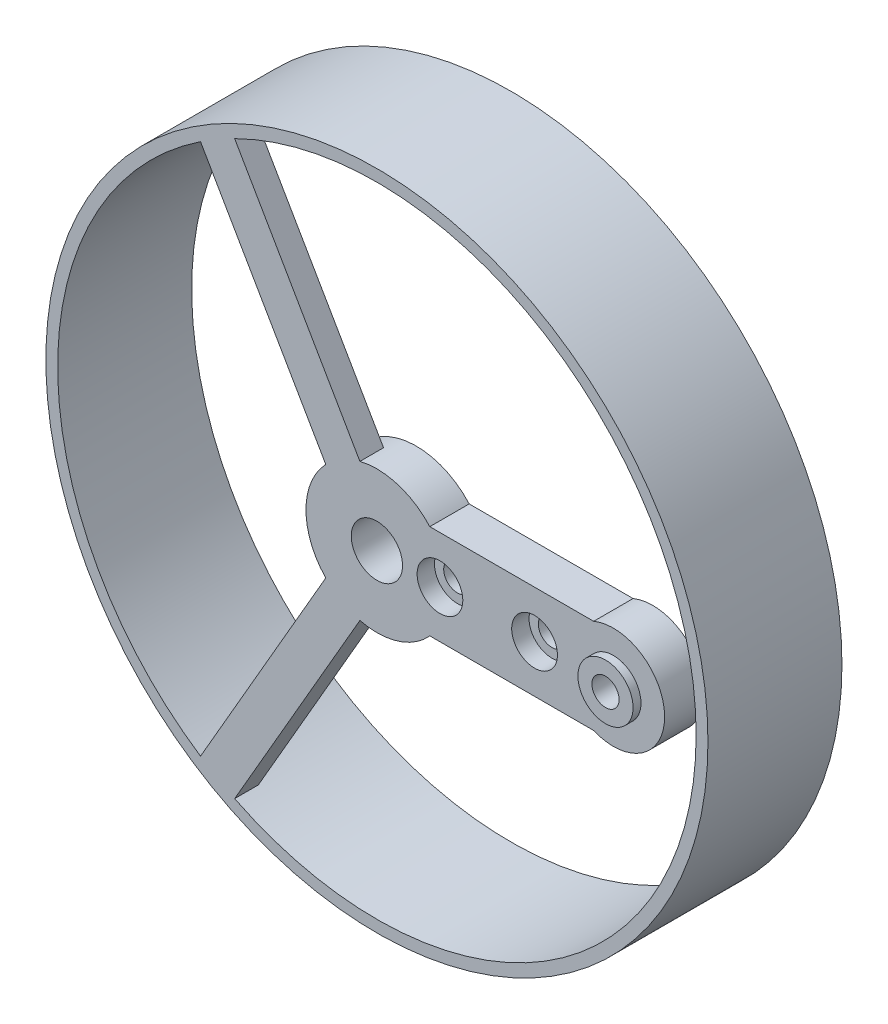
ISO-10303-21;
HEADER;
FILE_DESCRIPTION(('STEP AP214'),'2;1');
FILE_NAME('part.step','',(''),(''),'','','');
FILE_SCHEMA(('AUTOMOTIVE_DESIGN { 1 0 10303 214 1 1 1 1 }'));
ENDSEC;
DATA;
#1=APPLICATION_CONTEXT('core data for automotive mechanical design processes');
#2=APPLICATION_PROTOCOL_DEFINITION('international standard','automotive_design',2000,#1);
#3=PRODUCT_CONTEXT('',#1,'mechanical');
#4=PRODUCT('Part','Part','',(#3));
#5=PRODUCT_RELATED_PRODUCT_CATEGORY('part','',(#4));
#6=PRODUCT_DEFINITION_FORMATION('','',#4);
#7=PRODUCT_DEFINITION_CONTEXT('part definition',#1,'design');
#8=PRODUCT_DEFINITION('design','',#6,#7);
#9=PRODUCT_DEFINITION_SHAPE('','',#8);
#10=(LENGTH_UNIT() NAMED_UNIT(*) SI_UNIT(.MILLI.,.METRE.));
#11=(NAMED_UNIT(*) PLANE_ANGLE_UNIT() SI_UNIT($,.RADIAN.));
#12=(NAMED_UNIT(*) SI_UNIT($,.STERADIAN.) SOLID_ANGLE_UNIT());
#13=UNCERTAINTY_MEASURE_WITH_UNIT(LENGTH_MEASURE(1.E-05),#10,'distance_accuracy_value','');
#14=(GEOMETRIC_REPRESENTATION_CONTEXT(3) GLOBAL_UNCERTAINTY_ASSIGNED_CONTEXT((#13)) GLOBAL_UNIT_ASSIGNED_CONTEXT((#10,
#11,#12)) REPRESENTATION_CONTEXT('',''));
#15=CARTESIAN_POINT('',(0.,0.,0.));
#16=DIRECTION('',(0.,0.,1.));
#17=DIRECTION('',(1.,0.,0.));
#18=AXIS2_PLACEMENT_3D('',#15,#16,#17);
#19=CARTESIAN_POINT('',(0.,0.,-4.));
#20=DIRECTION('',(0.,0.,-1.));
#21=DIRECTION('',(-1.,0.,0.));
#22=AXIS2_PLACEMENT_3D('',#19,#20,#21);
#23=CYLINDRICAL_SURFACE('',#22,9.);
#24=DIRECTION('',(0.,0.,-1.));
#25=VECTOR('',#24,1.);
#26=CARTESIAN_POINT('',(-6.48796762590874,-6.23748956593597,-4.));
#27=LINE('',#26,#25);
#28=CARTESIAN_POINT('',(-6.48796762590875,-6.23748956593597,-4.));
#29=VERTEX_POINT('',#28);
#30=CARTESIAN_POINT('',(-6.48796762590875,-6.23748956593597,-7.));
#31=VERTEX_POINT('',#30);
#32=EDGE_CURVE('E126',#29,#31,#27,.T.);
#33=ORIENTED_EDGE('',*,*,#32,.F.);
#34=CARTESIAN_POINT('',(0.,0.,-4.));
#35=DIRECTION('',(0.,0.,1.));
#36=DIRECTION('',(1.,0.,0.));
#37=AXIS2_PLACEMENT_3D('',#34,#35,#36);
#38=CIRCLE('',#37,9.);
#39=CARTESIAN_POINT('',(-6.48796762590874,6.23748956593597,-4.));
#40=VERTEX_POINT('',#39);
#41=EDGE_CURVE('E239',#40,#29,#38,.T.);
#42=ORIENTED_EDGE('',*,*,#41,.F.);
#43=DIRECTION('',(0.,0.,-1.));
#44=VECTOR('',#43,1.);
#45=CARTESIAN_POINT('',(-6.48796762590874,6.23748956593597,-4.));
#46=LINE('',#45,#44);
#47=CARTESIAN_POINT('',(-6.48796762590874,6.23748956593597,-7.));
#48=VERTEX_POINT('',#47);
#49=EDGE_CURVE('E262',#48,#40,#46,.F.);
#50=ORIENTED_EDGE('',*,*,#49,.F.);
#51=CARTESIAN_POINT('',(0.,0.,-7.));
#52=DIRECTION('',(0.,0.,1.));
#53=DIRECTION('',(1.,0.,0.));
#54=AXIS2_PLACEMENT_3D('',#51,#52,#53);
#55=CIRCLE('',#54,9.);
#56=CARTESIAN_POINT('',(-2.15784060698655,8.73748956593597,-7.));
#57=VERTEX_POINT('',#56);
#58=EDGE_CURVE('E186',#57,#48,#55,.T.);
#59=ORIENTED_EDGE('',*,*,#58,.F.);
#60=DIRECTION('',(0.,0.,-1.));
#61=VECTOR('',#60,1.);
#62=CARTESIAN_POINT('',(-2.15784060698655,8.73748956593597,-4.));
#63=LINE('',#62,#61);
#64=CARTESIAN_POINT('',(-2.15784060698655,8.73748956593597,-4.));
#65=VERTEX_POINT('',#64);
#66=EDGE_CURVE('E267',#65,#57,#63,.T.);
#67=ORIENTED_EDGE('',*,*,#66,.F.);
#68=CARTESIAN_POINT('',(6.70820393249937,6.,-4.));
#69=VERTEX_POINT('',#68);
#70=EDGE_CURVE('E236',#69,#65,#38,.T.);
#71=ORIENTED_EDGE('',*,*,#70,.F.);
#72=DIRECTION('',(0.,0.,-1.));
#73=VECTOR('',#72,1.);
#74=CARTESIAN_POINT('',(6.70820393249937,6.,-4.));
#75=LINE('',#74,#73);
#76=CARTESIAN_POINT('',(6.70820393249937,6.,-9.));
#77=VERTEX_POINT('',#76);
#78=EDGE_CURVE('E237',#69,#77,#75,.T.);
#79=ORIENTED_EDGE('',*,*,#78,.T.);
#80=CARTESIAN_POINT('',(0.,0.,-9.));
#81=DIRECTION('',(0.,0.,1.));
#82=DIRECTION('',(1.,0.,0.));
#83=AXIS2_PLACEMENT_3D('',#80,#81,#82);
#84=CIRCLE('',#83,9.);
#85=CARTESIAN_POINT('',(6.70820393249937,-6.,-9.));
#86=VERTEX_POINT('',#85);
#87=EDGE_CURVE('E232',#77,#86,#84,.T.);
#88=ORIENTED_EDGE('',*,*,#87,.T.);
#89=DIRECTION('',(0.,0.,-1.));
#90=VECTOR('',#89,1.);
#91=CARTESIAN_POINT('',(6.70820393249937,-6.,-4.));
#92=LINE('',#91,#90);
#93=CARTESIAN_POINT('',(6.70820393249937,-6.,-4.));
#94=VERTEX_POINT('',#93);
#95=EDGE_CURVE('E244',#86,#94,#92,.F.);
#96=ORIENTED_EDGE('',*,*,#95,.T.);
#97=CARTESIAN_POINT('',(-2.15784060698655,-8.73748956593597,-4.));
#98=VERTEX_POINT('',#97);
#99=EDGE_CURVE('E58',#98,#94,#38,.T.);
#100=ORIENTED_EDGE('',*,*,#99,.F.);
#101=DIRECTION('',(0.,0.,-1.));
#102=VECTOR('',#101,1.);
#103=CARTESIAN_POINT('',(-2.15784060698655,-8.73748956593597,-4.));
#104=LINE('',#103,#102);
#105=CARTESIAN_POINT('',(-2.15784060698655,-8.73748956593597,-7.));
#106=VERTEX_POINT('',#105);
#107=EDGE_CURVE('E121',#106,#98,#104,.F.);
#108=ORIENTED_EDGE('',*,*,#107,.F.);
#109=CARTESIAN_POINT('',(0.,0.,-7.));
#110=DIRECTION('',(0.,0.,1.));
#111=DIRECTION('',(1.,0.,0.));
#112=AXIS2_PLACEMENT_3D('',#109,#110,#111);
#113=CIRCLE('',#112,9.);
#114=EDGE_CURVE('E53',#31,#106,#113,.T.);
#115=ORIENTED_EDGE('',*,*,#114,.F.);
#116=EDGE_LOOP('',(#33,#42,#50,#59,#67,#71,#79,#88,#96,#100,#108,#115));
#117=FACE_BOUND('',#116,.T.);
#118=ADVANCED_FACE('F39',(#117),#23,.T.);
#119=CARTESIAN_POINT('',(0.,0.,-4.));
#120=DIRECTION('',(0.,0.,-1.));
#121=DIRECTION('',(-1.,0.,0.));
#122=AXIS2_PLACEMENT_3D('',#119,#120,#121);
#123=CYLINDRICAL_SURFACE('',#122,40.5);
#124=CARTESIAN_POINT('',(0.,0.,-21.));
#125=DIRECTION('',(0.,0.,1.));
#126=DIRECTION('',(1.,0.,0.));
#127=AXIS2_PLACEMENT_3D('',#124,#125,#126);
#128=CIRCLE('',#127,40.5);
#129=CARTESIAN_POINT('',(40.5,0.,-21.));
#130=VERTEX_POINT('',#129);
#131=EDGE_CURVE('E149',#130,#130,#128,.T.);
#132=ORIENTED_EDGE('',*,*,#131,.F.);
#133=EDGE_LOOP('',(#132));
#134=FACE_BOUND('',#133,.T.);
#135=CARTESIAN_POINT('',(0.,0.,-4.));
#136=DIRECTION('',(0.,0.,1.));
#137=DIRECTION('',(1.,0.,0.));
#138=AXIS2_PLACEMENT_3D('',#135,#136,#137);
#139=CIRCLE('',#138,40.5);
#140=CARTESIAN_POINT('',(-22.3764464408688,33.7571421284286,-4.));
#141=VERTEX_POINT('',#140);
#142=CARTESIAN_POINT('',(-22.3764464408689,-33.7571421284286,-4.));
#143=VERTEX_POINT('',#142);
#144=EDGE_CURVE('E151',#141,#143,#139,.T.);
#145=ORIENTED_EDGE('',*,*,#144,.T.);
#146=DIRECTION('',(0.,0.,-1.));
#147=VECTOR('',#146,1.);
#148=CARTESIAN_POINT('',(-22.3764464408688,-33.7571421284286,-4.));
#149=LINE('',#148,#147);
#150=CARTESIAN_POINT('',(-22.3764464408689,-33.7571421284286,-7.));
#151=VERTEX_POINT('',#150);
#152=EDGE_CURVE('E11',#143,#151,#149,.T.);
#153=ORIENTED_EDGE('',*,*,#152,.T.);
#154=CARTESIAN_POINT('',(0.,0.,-7.));
#155=DIRECTION('',(0.,0.,1.));
#156=DIRECTION('',(1.,0.,0.));
#157=AXIS2_PLACEMENT_3D('',#154,#155,#156);
#158=CIRCLE('',#157,40.5);
#159=CARTESIAN_POINT('',(-18.0463194219467,-36.2571421284286,-7.));
#160=VERTEX_POINT('',#159);
#161=EDGE_CURVE('E275',#151,#160,#158,.T.);
#162=ORIENTED_EDGE('',*,*,#161,.T.);
#163=DIRECTION('',(0.,0.,-1.));
#164=VECTOR('',#163,1.);
#165=CARTESIAN_POINT('',(-18.0463194219467,-36.2571421284286,-4.));
#166=LINE('',#165,#164);
#167=CARTESIAN_POINT('',(-18.0463194219467,-36.2571421284286,-4.));
#168=VERTEX_POINT('',#167);
#169=EDGE_CURVE('E50',#160,#168,#166,.F.);
#170=ORIENTED_EDGE('',*,*,#169,.T.);
#171=CARTESIAN_POINT('',(-18.0463194219466,36.2571421284286,-4.));
#172=VERTEX_POINT('',#171);
#173=EDGE_CURVE('E154',#168,#172,#139,.T.);
#174=ORIENTED_EDGE('',*,*,#173,.T.);
#175=DIRECTION('',(0.,0.,-1.));
#176=VECTOR('',#175,1.);
#177=CARTESIAN_POINT('',(-18.0463194219466,36.2571421284286,-4.));
#178=LINE('',#177,#176);
#179=CARTESIAN_POINT('',(-18.0463194219466,36.2571421284286,-7.));
#180=VERTEX_POINT('',#179);
#181=EDGE_CURVE('E168',#180,#172,#178,.F.);
#182=ORIENTED_EDGE('',*,*,#181,.F.);
#183=CARTESIAN_POINT('',(0.,0.,-7.));
#184=DIRECTION('',(0.,0.,1.));
#185=DIRECTION('',(1.,0.,0.));
#186=AXIS2_PLACEMENT_3D('',#183,#184,#185);
#187=CIRCLE('',#186,40.5);
#188=CARTESIAN_POINT('',(-22.3764464408688,33.7571421284286,-7.));
#189=VERTEX_POINT('',#188);
#190=EDGE_CURVE('E266',#189,#180,#187,.F.);
#191=ORIENTED_EDGE('',*,*,#190,.F.);
#192=DIRECTION('',(0.,0.,-1.));
#193=VECTOR('',#192,1.);
#194=CARTESIAN_POINT('',(-22.3764464408688,33.7571421284286,-4.));
#195=LINE('',#194,#193);
#196=EDGE_CURVE('E163',#141,#189,#195,.T.);
#197=ORIENTED_EDGE('',*,*,#196,.F.);
#198=EDGE_LOOP('',(#145,#153,#162,#170,#174,#182,#191,#197));
#199=FACE_BOUND('',#198,.T.);
#200=ADVANCED_FACE('F273',(#134,#199),#123,.F.);
#201=CARTESIAN_POINT('',(0.,0.,-7.));
#202=DIRECTION('',(0.,0.,1.));
#203=DIRECTION('',(1.,0.,0.));
#204=AXIS2_PLACEMENT_3D('',#201,#202,#203);
#205=PLANE('',#204);
#206=DIRECTION('',(0.5,-0.866025403784439,0.));
#207=VECTOR('',#206,1.);
#208=CARTESIAN_POINT('',(-22.9150635094611,34.6900542570542,-7.));
#209=LINE('',#208,#207);
#210=EDGE_CURVE('E172',#189,#48,#209,.T.);
#211=ORIENTED_EDGE('',*,*,#210,.F.);
#212=ORIENTED_EDGE('',*,*,#190,.T.);
#213=DIRECTION('',(-0.5,0.866025403784439,0.));
#214=VECTOR('',#213,1.);
#215=CARTESIAN_POINT('',(-1.3349364905389,7.31217782649107,-7.));
#216=LINE('',#215,#214);
#217=EDGE_CURVE('E169',#57,#180,#216,.T.);
#218=ORIENTED_EDGE('',*,*,#217,.F.);
#219=ORIENTED_EDGE('',*,*,#58,.T.);
#220=EDGE_LOOP('',(#211,#212,#218,#219));
#221=FACE_BOUND('',#220,.T.);
#222=ADVANCED_FACE('F287',(#221),#205,.F.);
#223=CARTESIAN_POINT('',(20.,0.,-9.));
#224=DIRECTION('',(0.,0.,1.));
#225=DIRECTION('',(1.,0.,0.));
#226=AXIS2_PLACEMENT_3D('',#223,#224,#225);
#227=CYLINDRICAL_SURFACE('',#226,1.725);
#228=CARTESIAN_POINT('',(20.,0.,-9.));
#229=DIRECTION('',(0.,0.,1.));
#230=DIRECTION('',(1.,0.,0.));
#231=AXIS2_PLACEMENT_3D('',#228,#229,#230);
#232=CIRCLE('',#231,1.725);
#233=CARTESIAN_POINT('',(21.725,0.,-9.));
#234=VERTEX_POINT('',#233);
#235=EDGE_CURVE('E214',#234,#234,#232,.T.);
#236=ORIENTED_EDGE('',*,*,#235,.F.);
#237=EDGE_LOOP('',(#236));
#238=FACE_BOUND('',#237,.T.);
#239=CARTESIAN_POINT('',(20.,0.,-6.2));
#240=DIRECTION('',(0.,0.,1.));
#241=DIRECTION('',(1.,0.,0.));
#242=AXIS2_PLACEMENT_3D('',#239,#240,#241);
#243=CIRCLE('',#242,1.725);
#244=CARTESIAN_POINT('',(21.725,0.,-6.2));
#245=VERTEX_POINT('',#244);
#246=EDGE_CURVE('E199',#245,#245,#243,.F.);
#247=ORIENTED_EDGE('',*,*,#246,.F.);
#248=EDGE_LOOP('',(#247));
#249=FACE_BOUND('',#248,.T.);
#250=ADVANCED_FACE('F354',(#238,#249),#227,.F.);
#251=CARTESIAN_POINT('',(8.,0.,-9.));
#252=DIRECTION('',(0.,0.,1.));
#253=DIRECTION('',(1.,0.,0.));
#254=AXIS2_PLACEMENT_3D('',#251,#252,#253);
#255=CYLINDRICAL_SURFACE('',#254,1.725);
#256=CARTESIAN_POINT('',(8.,0.,-9.));
#257=DIRECTION('',(0.,0.,1.));
#258=DIRECTION('',(1.,0.,0.));
#259=AXIS2_PLACEMENT_3D('',#256,#257,#258);
#260=CIRCLE('',#259,1.725);
#261=CARTESIAN_POINT('',(9.725,0.,-9.));
#262=VERTEX_POINT('',#261);
#263=EDGE_CURVE('E213',#262,#262,#260,.T.);
#264=ORIENTED_EDGE('',*,*,#263,.F.);
#265=EDGE_LOOP('',(#264));
#266=FACE_BOUND('',#265,.T.);
#267=CARTESIAN_POINT('',(8.,0.,-6.2));
#268=DIRECTION('',(0.,0.,1.));
#269=DIRECTION('',(1.,0.,0.));
#270=AXIS2_PLACEMENT_3D('',#267,#268,#269);
#271=CIRCLE('',#270,1.725);
#272=CARTESIAN_POINT('',(9.725,0.,-6.2));
#273=VERTEX_POINT('',#272);
#274=EDGE_CURVE('E210',#273,#273,#271,.F.);
#275=ORIENTED_EDGE('',*,*,#274,.F.);
#276=EDGE_LOOP('',(#275));
#277=FACE_BOUND('',#276,.T.);
#278=ADVANCED_FACE('F314',(#266,#277),#255,.F.);
#279=CARTESIAN_POINT('',(0.,-6.,-4.));
#280=DIRECTION('',(0.,1.,0.));
#281=DIRECTION('',(0.,0.,1.));
#282=AXIS2_PLACEMENT_3D('',#279,#280,#281);
#283=PLANE('',#282);
#284=DIRECTION('',(0.,0.,-1.));
#285=VECTOR('',#284,1.);
#286=CARTESIAN_POINT('',(27.5,-6.,-4.));
#287=LINE('',#286,#285);
#288=CARTESIAN_POINT('',(27.5,-6.,-4.));
#289=VERTEX_POINT('',#288);
#290=CARTESIAN_POINT('',(27.5,-6.,-9.));
#291=VERTEX_POINT('',#290);
#292=EDGE_CURVE('E235',#289,#291,#287,.T.);
#293=ORIENTED_EDGE('',*,*,#292,.F.);
#294=DIRECTION('',(1.,0.,0.));
#295=VECTOR('',#294,1.);
#296=CARTESIAN_POINT('',(0.,-6.,-4.));
#297=LINE('',#296,#295);
#298=EDGE_CURVE('E247',#94,#289,#297,.T.);
#299=ORIENTED_EDGE('',*,*,#298,.F.);
#300=ORIENTED_EDGE('',*,*,#95,.F.);
#301=DIRECTION('',(1.,0.,0.));
#302=VECTOR('',#301,1.);
#303=CARTESIAN_POINT('',(0.,-6.,-9.));
#304=LINE('',#303,#302);
#305=EDGE_CURVE('E250',#86,#291,#304,.T.);
#306=ORIENTED_EDGE('',*,*,#305,.T.);
#307=EDGE_LOOP('',(#293,#299,#300,#306));
#308=FACE_BOUND('',#307,.T.);
#309=ADVANCED_FACE('F41',(#308),#283,.F.);
#310=CARTESIAN_POINT('',(30.,6.,-4.));
#311=DIRECTION('',(0.,-1.,0.));
#312=DIRECTION('',(0.,0.,-1.));
#313=AXIS2_PLACEMENT_3D('',#310,#311,#312);
#314=PLANE('',#313);
#315=DIRECTION('',(0.,0.,-1.));
#316=VECTOR('',#315,1.);
#317=CARTESIAN_POINT('',(27.5,6.,-4.));
#318=LINE('',#317,#316);
#319=CARTESIAN_POINT('',(27.5,6.,-9.));
#320=VERTEX_POINT('',#319);
#321=CARTESIAN_POINT('',(27.5,6.,-4.));
#322=VERTEX_POINT('',#321);
#323=EDGE_CURVE('E227',#320,#322,#318,.F.);
#324=ORIENTED_EDGE('',*,*,#323,.F.);
#325=DIRECTION('',(-1.,0.,0.));
#326=VECTOR('',#325,1.);
#327=CARTESIAN_POINT('',(30.,6.,-9.));
#328=LINE('',#327,#326);
#329=EDGE_CURVE('E252',#320,#77,#328,.T.);
#330=ORIENTED_EDGE('',*,*,#329,.T.);
#331=ORIENTED_EDGE('',*,*,#78,.F.);
#332=DIRECTION('',(-1.,0.,0.));
#333=VECTOR('',#332,1.);
#334=CARTESIAN_POINT('',(30.,6.,-4.));
#335=LINE('',#334,#333);
#336=EDGE_CURVE('E188',#322,#69,#335,.T.);
#337=ORIENTED_EDGE('',*,*,#336,.F.);
#338=EDGE_LOOP('',(#324,#330,#331,#337));
#339=FACE_BOUND('',#338,.T.);
#340=ADVANCED_FACE('F310',(#339),#314,.F.);
#341=CARTESIAN_POINT('',(0.,0.,-4.));
#342=DIRECTION('',(0.,0.,1.));
#343=DIRECTION('',(1.,0.,0.));
#344=AXIS2_PLACEMENT_3D('',#341,#342,#343);
#345=PLANE('',#344);
#346=ORIENTED_EDGE('',*,*,#173,.F.);
#347=DIRECTION('',(0.5,0.866025403784438,0.));
#348=VECTOR('',#347,1.);
#349=CARTESIAN_POINT('',(-18.5849364905389,-37.1900542570542,-4.));
#350=LINE('',#349,#348);
#351=EDGE_CURVE('E143',#168,#98,#350,.T.);
#352=ORIENTED_EDGE('',*,*,#351,.T.);
#353=ORIENTED_EDGE('',*,*,#99,.T.);
#354=ORIENTED_EDGE('',*,*,#298,.T.);
#355=CARTESIAN_POINT('',(30.,0.,-4.));
#356=DIRECTION('',(0.,0.,1.));
#357=DIRECTION('',(1.,0.,0.));
#358=AXIS2_PLACEMENT_3D('',#355,#356,#357);
#359=CIRCLE('',#358,6.5);
#360=EDGE_CURVE('E221',#289,#322,#359,.T.);
#361=ORIENTED_EDGE('',*,*,#360,.T.);
#362=ORIENTED_EDGE('',*,*,#336,.T.);
#363=ORIENTED_EDGE('',*,*,#70,.T.);
#364=DIRECTION('',(-0.5,0.866025403784439,0.));
#365=VECTOR('',#364,1.);
#366=CARTESIAN_POINT('',(-1.3349364905389,7.31217782649107,-4.));
#367=LINE('',#366,#365);
#368=EDGE_CURVE('E167',#65,#172,#367,.T.);
#369=ORIENTED_EDGE('',*,*,#368,.T.);
#370=EDGE_LOOP('',(#346,#352,#353,#354,#361,#362,#363,#369));
#371=FACE_BOUND('',#370,.T.);
#372=ORIENTED_EDGE('',*,*,#41,.T.);
#373=DIRECTION('',(-0.5,-0.866025403784438,0.));
#374=VECTOR('',#373,1.);
#375=CARTESIAN_POINT('',(-5.6650635094611,-4.81217782649107,-4.));
#376=LINE('',#375,#374);
#377=EDGE_CURVE('E142',#29,#143,#376,.T.);
#378=ORIENTED_EDGE('',*,*,#377,.T.);
#379=ORIENTED_EDGE('',*,*,#144,.F.);
#380=DIRECTION('',(0.5,-0.866025403784439,0.));
#381=VECTOR('',#380,1.);
#382=CARTESIAN_POINT('',(-22.9150635094611,34.6900542570542,-4.));
#383=LINE('',#382,#381);
#384=EDGE_CURVE('E173',#141,#40,#383,.T.);
#385=ORIENTED_EDGE('',*,*,#384,.T.);
#386=EDGE_LOOP('',(#372,#378,#379,#385));
#387=FACE_BOUND('',#386,.T.);
#388=CARTESIAN_POINT('',(30.,0.,-4.));
#389=DIRECTION('',(0.,0.,1.));
#390=DIRECTION('',(1.,0.,0.));
#391=AXIS2_PLACEMENT_3D('',#388,#389,#390);
#392=CIRCLE('',#391,3.5);
#393=CARTESIAN_POINT('',(33.5,0.,-4.));
#394=VERTEX_POINT('',#393);
#395=EDGE_CURVE('E187',#394,#394,#392,.T.);
#396=ORIENTED_EDGE('',*,*,#395,.F.);
#397=EDGE_LOOP('',(#396));
#398=FACE_BOUND('',#397,.T.);
#399=CARTESIAN_POINT('',(20.,0.,-4.));
#400=DIRECTION('',(0.,0.,1.));
#401=DIRECTION('',(1.,0.,0.));
#402=AXIS2_PLACEMENT_3D('',#399,#400,#401);
#403=CIRCLE('',#402,2.9);
#404=CARTESIAN_POINT('',(22.9,0.,-4.));
#405=VERTEX_POINT('',#404);
#406=EDGE_CURVE('E200',#405,#405,#403,.T.);
#407=ORIENTED_EDGE('',*,*,#406,.F.);
#408=EDGE_LOOP('',(#407));
#409=FACE_BOUND('',#408,.T.);
#410=CARTESIAN_POINT('',(8.,0.,-4.));
#411=DIRECTION('',(0.,0.,1.));
#412=DIRECTION('',(1.,0.,0.));
#413=AXIS2_PLACEMENT_3D('',#410,#411,#412);
#414=CIRCLE('',#413,2.9);
#415=CARTESIAN_POINT('',(10.9,0.,-4.));
#416=VERTEX_POINT('',#415);
#417=EDGE_CURVE('E201',#416,#416,#414,.T.);
#418=ORIENTED_EDGE('',*,*,#417,.F.);
#419=EDGE_LOOP('',(#418));
#420=FACE_BOUND('',#419,.T.);
#421=CARTESIAN_POINT('',(0.,0.,-4.));
#422=DIRECTION('',(0.,0.,1.));
#423=DIRECTION('',(1.,0.,0.));
#424=AXIS2_PLACEMENT_3D('',#421,#422,#423);
#425=CIRCLE('',#424,3.25);
#426=CARTESIAN_POINT('',(3.25,0.,-4.));
#427=VERTEX_POINT('',#426);
#428=EDGE_CURVE('E219',#427,#427,#425,.T.);
#429=ORIENTED_EDGE('',*,*,#428,.F.);
#430=EDGE_LOOP('',(#429));
#431=FACE_BOUND('',#430,.T.);
#432=CARTESIAN_POINT('',(0.,0.,-4.));
#433=DIRECTION('',(0.,0.,1.));
#434=DIRECTION('',(1.,0.,0.));
#435=AXIS2_PLACEMENT_3D('',#432,#433,#434);
#436=CIRCLE('',#435,42.);
#437=CARTESIAN_POINT('',(42.,0.,-4.));
#438=VERTEX_POINT('',#437);
#439=EDGE_CURVE('E159',#438,#438,#436,.T.);
#440=ORIENTED_EDGE('',*,*,#439,.T.);
#441=EDGE_LOOP('',(#440));
#442=FACE_BOUND('',#441,.T.);
#443=ADVANCED_FACE('F280',(#371,#387,#398,#409,#420,#431,#442),#345,.T.);
#444=CARTESIAN_POINT('',(0.,0.,-9.));
#445=DIRECTION('',(0.,0.,1.));
#446=DIRECTION('',(1.,0.,0.));
#447=AXIS2_PLACEMENT_3D('',#444,#445,#446);
#448=PLANE('',#447);
#449=CARTESIAN_POINT('',(30.,0.,-9.));
#450=DIRECTION('',(0.,0.,1.));
#451=DIRECTION('',(1.,0.,0.));
#452=AXIS2_PLACEMENT_3D('',#449,#450,#451);
#453=CIRCLE('',#452,2.9);
#454=CARTESIAN_POINT('',(32.9,0.,-9.));
#455=VERTEX_POINT('',#454);
#456=EDGE_CURVE('E184',#455,#455,#453,.T.);
#457=ORIENTED_EDGE('',*,*,#456,.T.);
#458=EDGE_LOOP('',(#457));
#459=FACE_BOUND('',#458,.T.);
#460=ORIENTED_EDGE('',*,*,#263,.T.);
#461=EDGE_LOOP('',(#460));
#462=FACE_BOUND('',#461,.T.);
#463=ORIENTED_EDGE('',*,*,#235,.T.);
#464=EDGE_LOOP('',(#463));
#465=FACE_BOUND('',#464,.T.);
#466=CARTESIAN_POINT('',(0.,0.,-9.));
#467=DIRECTION('',(0.,0.,1.));
#468=DIRECTION('',(1.,0.,0.));
#469=AXIS2_PLACEMENT_3D('',#466,#467,#468);
#470=CIRCLE('',#469,3.25);
#471=CARTESIAN_POINT('',(3.25,0.,-9.));
#472=VERTEX_POINT('',#471);
#473=EDGE_CURVE('E212',#472,#472,#470,.T.);
#474=ORIENTED_EDGE('',*,*,#473,.T.);
#475=EDGE_LOOP('',(#474));
#476=FACE_BOUND('',#475,.T.);
#477=ORIENTED_EDGE('',*,*,#329,.F.);
#478=CARTESIAN_POINT('',(30.,0.,-9.));
#479=DIRECTION('',(0.,0.,1.));
#480=DIRECTION('',(1.,0.,0.));
#481=AXIS2_PLACEMENT_3D('',#478,#479,#480);
#482=CIRCLE('',#481,6.5);
#483=EDGE_CURVE('E224',#291,#320,#482,.T.);
#484=ORIENTED_EDGE('',*,*,#483,.F.);
#485=ORIENTED_EDGE('',*,*,#305,.F.);
#486=ORIENTED_EDGE('',*,*,#87,.F.);
#487=EDGE_LOOP('',(#477,#484,#485,#486));
#488=FACE_BOUND('',#487,.T.);
#489=ADVANCED_FACE('F305',(#459,#462,#465,#476,#488),#448,.F.);
#490=CARTESIAN_POINT('',(30.,0.,-4.));
#491=DIRECTION('',(0.,0.,-1.));
#492=DIRECTION('',(-1.,0.,0.));
#493=AXIS2_PLACEMENT_3D('',#490,#491,#492);
#494=CYLINDRICAL_SURFACE('',#493,6.5);
#495=ORIENTED_EDGE('',*,*,#360,.F.);
#496=ORIENTED_EDGE('',*,*,#292,.T.);
#497=ORIENTED_EDGE('',*,*,#483,.T.);
#498=ORIENTED_EDGE('',*,*,#323,.T.);
#499=EDGE_LOOP('',(#495,#496,#497,#498));
#500=FACE_BOUND('',#499,.T.);
#501=ADVANCED_FACE('F304',(#500),#494,.T.);
#502=CARTESIAN_POINT('',(0.,0.,-9.));
#503=DIRECTION('',(0.,0.,1.));
#504=DIRECTION('',(1.,0.,0.));
#505=AXIS2_PLACEMENT_3D('',#502,#503,#504);
#506=CYLINDRICAL_SURFACE('',#505,3.25);
#507=ORIENTED_EDGE('',*,*,#428,.T.);
#508=EDGE_LOOP('',(#507));
#509=FACE_BOUND('',#508,.T.);
#510=ORIENTED_EDGE('',*,*,#473,.F.);
#511=EDGE_LOOP('',(#510));
#512=FACE_BOUND('',#511,.T.);
#513=ADVANCED_FACE('F334',(#509,#512),#506,.F.);
#514=CARTESIAN_POINT('',(30.,0.,-9.));
#515=DIRECTION('',(0.,0.,1.));
#516=DIRECTION('',(1.,0.,0.));
#517=AXIS2_PLACEMENT_3D('',#514,#515,#516);
#518=CYLINDRICAL_SURFACE('',#517,1.725);
#519=CARTESIAN_POINT('',(30.,0.,-6.8));
#520=DIRECTION('',(0.,0.,1.));
#521=DIRECTION('',(1.,0.,0.));
#522=AXIS2_PLACEMENT_3D('',#519,#520,#521);
#523=CIRCLE('',#522,1.725);
#524=CARTESIAN_POINT('',(31.725,0.,-6.8));
#525=VERTEX_POINT('',#524);
#526=EDGE_CURVE('E192',#525,#525,#523,.F.);
#527=ORIENTED_EDGE('',*,*,#526,.T.);
#528=EDGE_LOOP('',(#527));
#529=FACE_BOUND('',#528,.T.);
#530=CARTESIAN_POINT('',(30.,0.,-3.));
#531=DIRECTION('',(0.,0.,1.));
#532=DIRECTION('',(1.,0.,0.));
#533=AXIS2_PLACEMENT_3D('',#530,#531,#532);
#534=CIRCLE('',#533,1.725);
#535=CARTESIAN_POINT('',(31.725,0.,-3.));
#536=VERTEX_POINT('',#535);
#537=EDGE_CURVE('E176',#536,#536,#534,.T.);
#538=ORIENTED_EDGE('',*,*,#537,.T.);
#539=EDGE_LOOP('',(#538));
#540=FACE_BOUND('',#539,.T.);
#541=ADVANCED_FACE('F341',(#529,#540),#518,.F.);
#542=CARTESIAN_POINT('',(8.,0.,-6.2));
#543=DIRECTION('',(0.,0.,1.));
#544=DIRECTION('',(1.,0.,0.));
#545=AXIS2_PLACEMENT_3D('',#542,#543,#544);
#546=PLANE('',#545);
#547=CARTESIAN_POINT('',(8.,0.,-6.2));
#548=DIRECTION('',(0.,0.,1.));
#549=DIRECTION('',(1.,0.,0.));
#550=AXIS2_PLACEMENT_3D('',#547,#548,#549);
#551=CIRCLE('',#550,2.9);
#552=CARTESIAN_POINT('',(10.9,0.,-6.2));
#553=VERTEX_POINT('',#552);
#554=EDGE_CURVE('E206',#553,#553,#551,.T.);
#555=ORIENTED_EDGE('',*,*,#554,.T.);
#556=EDGE_LOOP('',(#555));
#557=FACE_BOUND('',#556,.T.);
#558=ORIENTED_EDGE('',*,*,#274,.T.);
#559=EDGE_LOOP('',(#558));
#560=FACE_BOUND('',#559,.T.);
#561=ADVANCED_FACE('F348',(#557,#560),#546,.T.);
#562=CARTESIAN_POINT('',(8.,0.,-4.));
#563=DIRECTION('',(0.,0.,-1.));
#564=DIRECTION('',(-1.,0.,0.));
#565=AXIS2_PLACEMENT_3D('',#562,#563,#564);
#566=CYLINDRICAL_SURFACE('',#565,2.9);
#567=ORIENTED_EDGE('',*,*,#417,.T.);
#568=EDGE_LOOP('',(#567));
#569=FACE_BOUND('',#568,.T.);
#570=ORIENTED_EDGE('',*,*,#554,.F.);
#571=EDGE_LOOP('',(#570));
#572=FACE_BOUND('',#571,.T.);
#573=ADVANCED_FACE('F360',(#569,#572),#566,.F.);
#574=CARTESIAN_POINT('',(20.,0.,-6.2));
#575=DIRECTION('',(0.,0.,1.));
#576=DIRECTION('',(1.,0.,0.));
#577=AXIS2_PLACEMENT_3D('',#574,#575,#576);
#578=PLANE('',#577);
#579=CARTESIAN_POINT('',(20.,0.,-6.2));
#580=DIRECTION('',(0.,0.,1.));
#581=DIRECTION('',(1.,0.,0.));
#582=AXIS2_PLACEMENT_3D('',#579,#580,#581);
#583=CIRCLE('',#582,2.9);
#584=CARTESIAN_POINT('',(22.9,0.,-6.2));
#585=VERTEX_POINT('',#584);
#586=EDGE_CURVE('E202',#585,#585,#583,.T.);
#587=ORIENTED_EDGE('',*,*,#586,.T.);
#588=EDGE_LOOP('',(#587));
#589=FACE_BOUND('',#588,.T.);
#590=ORIENTED_EDGE('',*,*,#246,.T.);
#591=EDGE_LOOP('',(#590));
#592=FACE_BOUND('',#591,.T.);
#593=ADVANCED_FACE('F365',(#589,#592),#578,.T.);
#594=CARTESIAN_POINT('',(20.,0.,-4.));
#595=DIRECTION('',(0.,0.,-1.));
#596=DIRECTION('',(-1.,0.,0.));
#597=AXIS2_PLACEMENT_3D('',#594,#595,#596);
#598=CYLINDRICAL_SURFACE('',#597,2.9);
#599=ORIENTED_EDGE('',*,*,#406,.T.);
#600=EDGE_LOOP('',(#599));
#601=FACE_BOUND('',#600,.T.);
#602=ORIENTED_EDGE('',*,*,#586,.F.);
#603=EDGE_LOOP('',(#602));
#604=FACE_BOUND('',#603,.T.);
#605=ADVANCED_FACE('F370',(#601,#604),#598,.F.);
#606=CARTESIAN_POINT('',(30.,0.,-6.8));
#607=DIRECTION('',(0.,0.,1.));
#608=DIRECTION('',(1.,0.,0.));
#609=AXIS2_PLACEMENT_3D('',#606,#607,#608);
#610=PLANE('',#609);
#611=CARTESIAN_POINT('',(30.,0.,-6.8));
#612=DIRECTION('',(0.,0.,1.));
#613=DIRECTION('',(1.,0.,0.));
#614=AXIS2_PLACEMENT_3D('',#611,#612,#613);
#615=CIRCLE('',#614,2.9);
#616=CARTESIAN_POINT('',(32.9,0.,-6.8));
#617=VERTEX_POINT('',#616);
#618=EDGE_CURVE('E193',#617,#617,#615,.T.);
#619=ORIENTED_EDGE('',*,*,#618,.F.);
#620=EDGE_LOOP('',(#619));
#621=FACE_BOUND('',#620,.T.);
#622=ORIENTED_EDGE('',*,*,#526,.F.);
#623=EDGE_LOOP('',(#622));
#624=FACE_BOUND('',#623,.T.);
#625=ADVANCED_FACE('F367',(#621,#624),#610,.F.);
#626=CARTESIAN_POINT('',(30.,0.,-6.8));
#627=DIRECTION('',(0.,0.,-1.));
#628=DIRECTION('',(-1.,0.,0.));
#629=AXIS2_PLACEMENT_3D('',#626,#627,#628);
#630=CYLINDRICAL_SURFACE('',#629,2.9);
#631=ORIENTED_EDGE('',*,*,#618,.T.);
#632=EDGE_LOOP('',(#631));
#633=FACE_BOUND('',#632,.T.);
#634=ORIENTED_EDGE('',*,*,#456,.F.);
#635=EDGE_LOOP('',(#634));
#636=FACE_BOUND('',#635,.T.);
#637=ADVANCED_FACE('F372',(#633,#636),#630,.F.);
#638=CARTESIAN_POINT('',(30.,0.,-3.));
#639=DIRECTION('',(0.,0.,1.));
#640=DIRECTION('',(1.,0.,0.));
#641=AXIS2_PLACEMENT_3D('',#638,#639,#640);
#642=PLANE('',#641);
#643=ORIENTED_EDGE('',*,*,#537,.F.);
#644=EDGE_LOOP('',(#643));
#645=FACE_BOUND('',#644,.T.);
#646=CARTESIAN_POINT('',(30.,0.,-3.));
#647=DIRECTION('',(0.,0.,1.));
#648=DIRECTION('',(1.,0.,0.));
#649=AXIS2_PLACEMENT_3D('',#646,#647,#648);
#650=CIRCLE('',#649,3.5);
#651=CARTESIAN_POINT('',(33.5,0.,-3.));
#652=VERTEX_POINT('',#651);
#653=EDGE_CURVE('E185',#652,#652,#650,.T.);
#654=ORIENTED_EDGE('',*,*,#653,.T.);
#655=EDGE_LOOP('',(#654));
#656=FACE_BOUND('',#655,.T.);
#657=ADVANCED_FACE('F380',(#645,#656),#642,.T.);
#658=CARTESIAN_POINT('',(30.,0.,-3.));
#659=DIRECTION('',(0.,0.,-1.));
#660=DIRECTION('',(-1.,0.,0.));
#661=AXIS2_PLACEMENT_3D('',#658,#659,#660);
#662=CYLINDRICAL_SURFACE('',#661,3.5);
#663=ORIENTED_EDGE('',*,*,#653,.F.);
#664=EDGE_LOOP('',(#663));
#665=FACE_BOUND('',#664,.T.);
#666=ORIENTED_EDGE('',*,*,#395,.T.);
#667=EDGE_LOOP('',(#666));
#668=FACE_BOUND('',#667,.T.);
#669=ADVANCED_FACE('F382',(#665,#668),#662,.T.);
#670=CARTESIAN_POINT('',(-1.3349364905389,7.31217782649107,-4.));
#671=DIRECTION('',(-0.866025403784439,-0.5,0.));
#672=DIRECTION('',(0.5,-0.866025403784439,0.));
#673=AXIS2_PLACEMENT_3D('',#670,#671,#672);
#674=PLANE('',#673);
#675=ORIENTED_EDGE('',*,*,#217,.T.);
#676=ORIENTED_EDGE('',*,*,#181,.T.);
#677=ORIENTED_EDGE('',*,*,#368,.F.);
#678=ORIENTED_EDGE('',*,*,#66,.T.);
#679=EDGE_LOOP('',(#675,#676,#677,#678));
#680=FACE_BOUND('',#679,.T.);
#681=ADVANCED_FACE('F285',(#680),#674,.F.);
#682=CARTESIAN_POINT('',(-22.9150635094611,34.6900542570542,-4.));
#683=DIRECTION('',(0.866025403784439,0.5,0.));
#684=DIRECTION('',(-0.5,0.866025403784439,0.));
#685=AXIS2_PLACEMENT_3D('',#682,#683,#684);
#686=PLANE('',#685);
#687=ORIENTED_EDGE('',*,*,#384,.F.);
#688=ORIENTED_EDGE('',*,*,#196,.T.);
#689=ORIENTED_EDGE('',*,*,#210,.T.);
#690=ORIENTED_EDGE('',*,*,#49,.T.);
#691=EDGE_LOOP('',(#687,#688,#689,#690));
#692=FACE_BOUND('',#691,.T.);
#693=ADVANCED_FACE('F288',(#692),#686,.F.);
#694=CARTESIAN_POINT('',(0.,0.,-21.));
#695=DIRECTION('',(0.,0.,1.));
#696=DIRECTION('',(1.,0.,0.));
#697=AXIS2_PLACEMENT_3D('',#694,#695,#696);
#698=PLANE('',#697);
#699=CARTESIAN_POINT('',(0.,0.,-21.));
#700=DIRECTION('',(0.,0.,1.));
#701=DIRECTION('',(1.,0.,0.));
#702=AXIS2_PLACEMENT_3D('',#699,#700,#701);
#703=CIRCLE('',#702,42.);
#704=CARTESIAN_POINT('',(42.,0.,-21.));
#705=VERTEX_POINT('',#704);
#706=EDGE_CURVE('E153',#705,#705,#703,.T.);
#707=ORIENTED_EDGE('',*,*,#706,.F.);
#708=EDGE_LOOP('',(#707));
#709=FACE_BOUND('',#708,.T.);
#710=ORIENTED_EDGE('',*,*,#131,.T.);
#711=EDGE_LOOP('',(#710));
#712=FACE_BOUND('',#711,.T.);
#713=ADVANCED_FACE('F391',(#709,#712),#698,.F.);
#714=CARTESIAN_POINT('',(0.,0.,-4.));
#715=DIRECTION('',(0.,0.,-1.));
#716=DIRECTION('',(-1.,0.,0.));
#717=AXIS2_PLACEMENT_3D('',#714,#715,#716);
#718=CYLINDRICAL_SURFACE('',#717,42.);
#719=ORIENTED_EDGE('',*,*,#439,.F.);
#720=EDGE_LOOP('',(#719));
#721=FACE_BOUND('',#720,.T.);
#722=ORIENTED_EDGE('',*,*,#706,.T.);
#723=EDGE_LOOP('',(#722));
#724=FACE_BOUND('',#723,.T.);
#725=ADVANCED_FACE('F393',(#721,#724),#718,.T.);
#726=CARTESIAN_POINT('',(-5.6650635094611,-4.81217782649107,-4.));
#727=DIRECTION('',(0.866025403784438,-0.5,0.));
#728=DIRECTION('',(0.5,0.866025403784438,0.));
#729=AXIS2_PLACEMENT_3D('',#726,#727,#728);
#730=PLANE('',#729);
#731=ORIENTED_EDGE('',*,*,#377,.F.);
#732=ORIENTED_EDGE('',*,*,#32,.T.);
#733=DIRECTION('',(-0.5,-0.866025403784438,0.));
#734=VECTOR('',#733,1.);
#735=CARTESIAN_POINT('',(-5.6650635094611,-4.81217782649107,-7.));
#736=LINE('',#735,#734);
#737=EDGE_CURVE('E137',#31,#151,#736,.T.);
#738=ORIENTED_EDGE('',*,*,#737,.T.);
#739=ORIENTED_EDGE('',*,*,#152,.F.);
#740=EDGE_LOOP('',(#731,#732,#738,#739));
#741=FACE_BOUND('',#740,.T.);
#742=ADVANCED_FACE('F400',(#741),#730,.F.);
#743=CARTESIAN_POINT('',(-18.5849364905389,-37.1900542570542,-4.));
#744=DIRECTION('',(-0.866025403784438,0.500000000000001,0.));
#745=DIRECTION('',(-0.500000000000001,-0.866025403784438,0.));
#746=AXIS2_PLACEMENT_3D('',#743,#744,#745);
#747=PLANE('',#746);
#748=DIRECTION('',(0.5,0.866025403784438,0.));
#749=VECTOR('',#748,1.);
#750=CARTESIAN_POINT('',(-18.5849364905389,-37.1900542570542,-7.));
#751=LINE('',#750,#749);
#752=EDGE_CURVE('E132',#160,#106,#751,.T.);
#753=ORIENTED_EDGE('',*,*,#752,.T.);
#754=ORIENTED_EDGE('',*,*,#107,.T.);
#755=ORIENTED_EDGE('',*,*,#351,.F.);
#756=ORIENTED_EDGE('',*,*,#169,.F.);
#757=EDGE_LOOP('',(#753,#754,#755,#756));
#758=FACE_BOUND('',#757,.T.);
#759=ADVANCED_FACE('F139',(#758),#747,.F.);
#760=CARTESIAN_POINT('',(0.,0.,-7.));
#761=DIRECTION('',(0.,0.,1.));
#762=DIRECTION('',(1.,0.,0.));
#763=AXIS2_PLACEMENT_3D('',#760,#761,#762);
#764=PLANE('',#763);
#765=ORIENTED_EDGE('',*,*,#737,.F.);
#766=ORIENTED_EDGE('',*,*,#114,.T.);
#767=ORIENTED_EDGE('',*,*,#752,.F.);
#768=ORIENTED_EDGE('',*,*,#161,.F.);
#769=EDGE_LOOP('',(#765,#766,#767,#768));
#770=FACE_BOUND('',#769,.T.);
#771=ADVANCED_FACE('F135',(#770),#764,.F.);
#772=CLOSED_SHELL('',(#118,#200,#222,#250,#278,#309,#340,#443,#489,#501,#513,#541,#561,#573,
#593,#605,#625,#637,#657,#669,#681,#693,#713,#725,#742,#759,#771));
#773=MANIFOLD_SOLID_BREP('B2',#772);
#774=ADVANCED_BREP_SHAPE_REPRESENTATION('',(#18,#773),#14);
#775=SHAPE_DEFINITION_REPRESENTATION(#9,#774);
ENDSEC;
END-ISO-10303-21;
